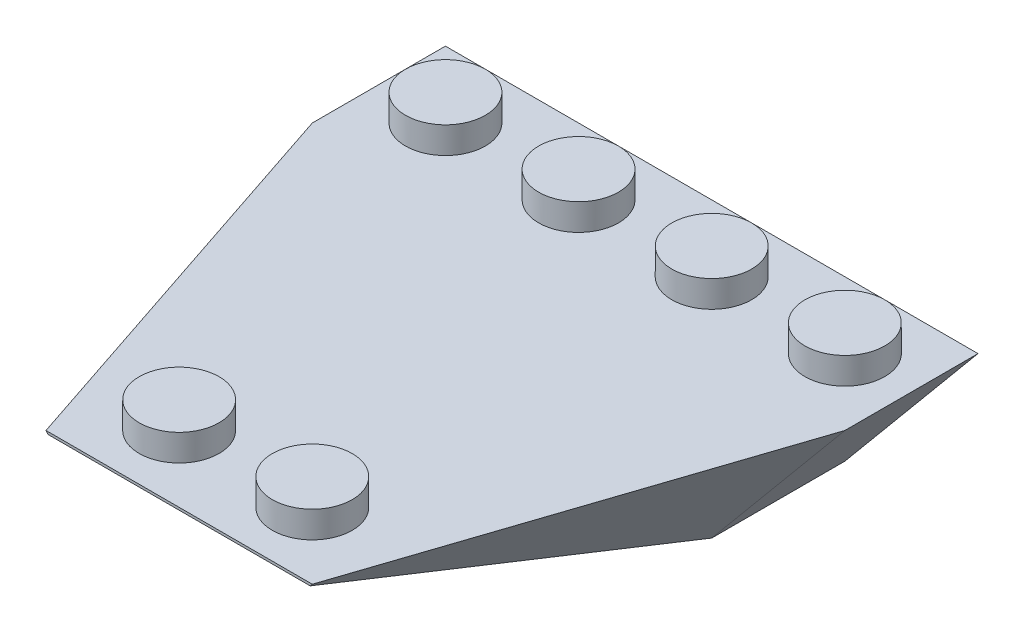
ISO-10303-21;
HEADER;
FILE_DESCRIPTION(('STEP AP214'),'2;1');
FILE_NAME('part.step','',(''),(''),'','','');
FILE_SCHEMA(('AUTOMOTIVE_DESIGN { 1 0 10303 214 1 1 1 1 }'));
ENDSEC;
DATA;
#1=APPLICATION_CONTEXT('core data for automotive mechanical design processes');
#2=APPLICATION_PROTOCOL_DEFINITION('international standard','automotive_design',2000,#1);
#3=PRODUCT_CONTEXT('',#1,'mechanical');
#4=PRODUCT('Part','Part','',(#3));
#5=PRODUCT_RELATED_PRODUCT_CATEGORY('part','',(#4));
#6=PRODUCT_DEFINITION_FORMATION('','',#4);
#7=PRODUCT_DEFINITION_CONTEXT('part definition',#1,'design');
#8=PRODUCT_DEFINITION('design','',#6,#7);
#9=PRODUCT_DEFINITION_SHAPE('','',#8);
#10=(LENGTH_UNIT() NAMED_UNIT(*) SI_UNIT(.MILLI.,.METRE.));
#11=(NAMED_UNIT(*) PLANE_ANGLE_UNIT() SI_UNIT($,.RADIAN.));
#12=(NAMED_UNIT(*) SI_UNIT($,.STERADIAN.) SOLID_ANGLE_UNIT());
#13=UNCERTAINTY_MEASURE_WITH_UNIT(LENGTH_MEASURE(1.E-05),#10,'distance_accuracy_value','');
#14=(GEOMETRIC_REPRESENTATION_CONTEXT(3) GLOBAL_UNCERTAINTY_ASSIGNED_CONTEXT((#13)) GLOBAL_UNIT_ASSIGNED_CONTEXT((#10,
#11,#12)) REPRESENTATION_CONTEXT('',''));
#15=CARTESIAN_POINT('',(0.,0.,0.));
#16=DIRECTION('',(0.,0.,1.));
#17=DIRECTION('',(1.,0.,0.));
#18=AXIS2_PLACEMENT_3D('',#15,#16,#17);
#19=CARTESIAN_POINT('',(0.,0.,0.));
#20=DIRECTION('',(0.,0.,-1.));
#21=DIRECTION('',(-1.,0.,0.));
#22=AXIS2_PLACEMENT_3D('',#19,#20,#21);
#23=PLANE('',#22);
#24=DIRECTION('',(1.,0.,0.));
#25=VECTOR('',#24,1.);
#26=CARTESIAN_POINT('',(-8.,0.,0.));
#27=LINE('',#26,#25);
#28=CARTESIAN_POINT('',(5.91726675309156,0.,0.));
#29=VERTEX_POINT('',#28);
#30=CARTESIAN_POINT('',(8.,0.,0.));
#31=VERTEX_POINT('',#30);
#32=EDGE_CURVE('E58',#29,#31,#27,.T.);
#33=ORIENTED_EDGE('',*,*,#32,.F.);
#34=DIRECTION('',(0.64018439966448,0.768221279597376,0.));
#35=VECTOR('',#34,1.);
#36=CARTESIAN_POINT('',(3.49215742805404,-2.91013119004503,0.));
#37=LINE('',#36,#35);
#38=CARTESIAN_POINT('',(12.5839334197582,8.,0.));
#39=VERTEX_POINT('',#38);
#40=EDGE_CURVE('E196',#29,#39,#37,.T.);
#41=ORIENTED_EDGE('',*,*,#40,.T.);
#42=DIRECTION('',(-1.,0.,0.));
#43=VECTOR('',#42,1.);
#44=CARTESIAN_POINT('',(0.,8.,0.));
#45=LINE('',#44,#43);
#46=CARTESIAN_POINT('',(-12.5839334197582,8.,0.));
#47=VERTEX_POINT('',#46);
#48=EDGE_CURVE('E211',#39,#47,#45,.T.);
#49=ORIENTED_EDGE('',*,*,#48,.T.);
#50=DIRECTION('',(0.64018439966448,-0.768221279597376,0.));
#51=VECTOR('',#50,1.);
#52=CARTESIAN_POINT('',(-3.49215742805403,-2.91013119004503,0.));
#53=LINE('',#52,#51);
#54=CARTESIAN_POINT('',(-5.91726675309156,0.,0.));
#55=VERTEX_POINT('',#54);
#56=EDGE_CURVE('E214',#47,#55,#53,.T.);
#57=ORIENTED_EDGE('',*,*,#56,.T.);
#58=CARTESIAN_POINT('',(-8.,0.,0.));
#59=VERTEX_POINT('',#58);
#60=EDGE_CURVE('E376',#59,#55,#27,.T.);
#61=ORIENTED_EDGE('',*,*,#60,.F.);
#62=DIRECTION('',(0.64018439966448,-0.768221279597376,0.));
#63=VECTOR('',#62,1.);
#64=CARTESIAN_POINT('',(-16.,9.6,0.));
#65=LINE('',#64,#63);
#66=CARTESIAN_POINT('',(-16.,9.6,0.));
#67=VERTEX_POINT('',#66);
#68=EDGE_CURVE('E460',#67,#59,#65,.T.);
#69=ORIENTED_EDGE('',*,*,#68,.F.);
#70=DIRECTION('',(-1.,0.,0.));
#71=VECTOR('',#70,1.);
#72=CARTESIAN_POINT('',(16.,9.6,0.));
#73=LINE('',#72,#71);
#74=CARTESIAN_POINT('',(16.,9.6,0.));
#75=VERTEX_POINT('',#74);
#76=EDGE_CURVE('E446',#75,#67,#73,.T.);
#77=ORIENTED_EDGE('',*,*,#76,.F.);
#78=DIRECTION('',(0.64018439966448,0.768221279597376,0.));
#79=VECTOR('',#78,1.);
#80=CARTESIAN_POINT('',(8.,0.,0.));
#81=LINE('',#80,#79);
#82=EDGE_CURVE('E319',#31,#75,#81,.T.);
#83=ORIENTED_EDGE('',*,*,#82,.F.);
#84=EDGE_LOOP('',(#33,#41,#49,#57,#61,#69,#77,#83));
#85=FACE_BOUND('',#84,.T.);
#86=ADVANCED_FACE('F54',(#85),#23,.T.);
#87=CARTESIAN_POINT('',(0.,0.,0.));
#88=DIRECTION('',(0.,1.,0.));
#89=DIRECTION('',(-1.,0.,0.));
#90=AXIS2_PLACEMENT_3D('',#87,#88,#89);
#91=PLANE('',#90);
#92=DIRECTION('',(0.,0.,1.));
#93=VECTOR('',#92,1.);
#94=CARTESIAN_POINT('',(5.91726675309156,0.,0.));
#95=LINE('',#94,#93);
#96=CARTESIAN_POINT('',(5.91726675309156,0.,3.63285359186768));
#97=VERTEX_POINT('',#96);
#98=EDGE_CURVE('E222',#29,#97,#95,.T.);
#99=ORIENTED_EDGE('',*,*,#98,.F.);
#100=ORIENTED_EDGE('',*,*,#32,.T.);
#101=DIRECTION('',(0.,0.,1.));
#102=VECTOR('',#101,1.);
#103=CARTESIAN_POINT('',(8.,0.,0.));
#104=LINE('',#103,#102);
#105=CARTESIAN_POINT('',(8.,0.,8.));
#106=VERTEX_POINT('',#105);
#107=EDGE_CURVE('E475',#31,#106,#104,.T.);
#108=ORIENTED_EDGE('',*,*,#107,.T.);
#109=DIRECTION('',(1.,0.,0.));
#110=VECTOR('',#109,1.);
#111=CARTESIAN_POINT('',(8.,0.,8.));
#112=LINE('',#111,#110);
#113=CARTESIAN_POINT('',(-8.,0.,8.));
#114=VERTEX_POINT('',#113);
#115=EDGE_CURVE('E473',#114,#106,#112,.T.);
#116=ORIENTED_EDGE('',*,*,#115,.F.);
#117=DIRECTION('',(0.,0.,1.));
#118=VECTOR('',#117,1.);
#119=CARTESIAN_POINT('',(-8.,0.,0.));
#120=LINE('',#119,#118);
#121=EDGE_CURVE('E80',#59,#114,#120,.T.);
#122=ORIENTED_EDGE('',*,*,#121,.F.);
#123=ORIENTED_EDGE('',*,*,#60,.T.);
#124=DIRECTION('',(0.,0.,1.));
#125=VECTOR('',#124,1.);
#126=CARTESIAN_POINT('',(-5.91726675309156,0.,0.));
#127=LINE('',#126,#125);
#128=CARTESIAN_POINT('',(-5.91726675309156,0.,3.63285359186767));
#129=VERTEX_POINT('',#128);
#130=EDGE_CURVE('E224',#55,#129,#127,.T.);
#131=ORIENTED_EDGE('',*,*,#130,.T.);
#132=DIRECTION('',(1.,0.,0.));
#133=VECTOR('',#132,1.);
#134=CARTESIAN_POINT('',(0.,0.,3.63285359186768));
#135=LINE('',#134,#133);
#136=EDGE_CURVE('E188',#129,#97,#135,.T.);
#137=ORIENTED_EDGE('',*,*,#136,.T.);
#138=EDGE_LOOP('',(#99,#100,#108,#116,#122,#123,#131,#137));
#139=FACE_BOUND('',#138,.T.);
#140=ADVANCED_FACE('F382',(#139),#91,.F.);
#141=CARTESIAN_POINT('',(-4.00000000000001,11.2,4.));
#142=DIRECTION('',(0.,1.,0.));
#143=DIRECTION('',(-1.,0.,0.));
#144=AXIS2_PLACEMENT_3D('',#141,#142,#143);
#145=PLANE('',#144);
#146=CARTESIAN_POINT('',(-4.00000000000001,11.2,4.));
#147=DIRECTION('',(0.,1.,0.));
#148=DIRECTION('',(-1.,0.,0.));
#149=AXIS2_PLACEMENT_3D('',#146,#147,#148);
#150=CIRCLE('',#149,2.4);
#151=CARTESIAN_POINT('',(-6.4,11.2,4.));
#152=VERTEX_POINT('',#151);
#153=EDGE_CURVE('E552',#152,#152,#150,.T.);
#154=ORIENTED_EDGE('',*,*,#153,.T.);
#155=EDGE_LOOP('',(#154));
#156=FACE_BOUND('',#155,.T.);
#157=ADVANCED_FACE('F56',(#156),#145,.T.);
#158=CARTESIAN_POINT('',(-4.00000000000001,11.2,4.));
#159=DIRECTION('',(0.,-1.,0.));
#160=DIRECTION('',(1.,0.,0.));
#161=AXIS2_PLACEMENT_3D('',#158,#159,#160);
#162=CYLINDRICAL_SURFACE('',#161,2.4);
#163=ORIENTED_EDGE('',*,*,#153,.F.);
#164=EDGE_LOOP('',(#163));
#165=FACE_BOUND('',#164,.T.);
#166=CARTESIAN_POINT('',(-4.00000000000001,9.6,4.));
#167=DIRECTION('',(0.,-1.,0.));
#168=DIRECTION('',(1.,0.,0.));
#169=AXIS2_PLACEMENT_3D('',#166,#167,#168);
#170=CIRCLE('',#169,2.4);
#171=CARTESIAN_POINT('',(-1.60000000000001,9.6,4.));
#172=VERTEX_POINT('',#171);
#173=EDGE_CURVE('E549',#172,#172,#170,.F.);
#174=ORIENTED_EDGE('',*,*,#173,.T.);
#175=EDGE_LOOP('',(#174));
#176=FACE_BOUND('',#175,.T.);
#177=ADVANCED_FACE('F621',(#165,#176),#162,.T.);
#178=CARTESIAN_POINT('',(-4.72131147540984,-3.9344262295082,0.));
#179=DIRECTION('',(0.768221279597376,0.64018439966448,0.));
#180=DIRECTION('',(-0.64018439966448,0.768221279597376,0.));
#181=AXIS2_PLACEMENT_3D('',#178,#179,#180);
#182=PLANE('',#181);
#183=ORIENTED_EDGE('',*,*,#121,.T.);
#184=DIRECTION('',(0.64018439966448,-0.768221279597376,0.));
#185=VECTOR('',#184,1.);
#186=CARTESIAN_POINT('',(-8.,0.,8.));
#187=LINE('',#186,#185);
#188=CARTESIAN_POINT('',(-16.,9.6,8.));
#189=VERTEX_POINT('',#188);
#190=EDGE_CURVE('E457',#189,#114,#187,.T.);
#191=ORIENTED_EDGE('',*,*,#190,.F.);
#192=DIRECTION('',(0.,0.,1.));
#193=VECTOR('',#192,1.);
#194=CARTESIAN_POINT('',(-16.,9.6,0.));
#195=LINE('',#194,#193);
#196=EDGE_CURVE('E439',#67,#189,#195,.T.);
#197=ORIENTED_EDGE('',*,*,#196,.F.);
#198=ORIENTED_EDGE('',*,*,#68,.T.);
#199=EDGE_LOOP('',(#183,#191,#197,#198));
#200=FACE_BOUND('',#199,.T.);
#201=ADVANCED_FACE('F391',(#200),#182,.F.);
#202=CARTESIAN_POINT('',(4.72131147540984,-3.93442622950819,0.));
#203=DIRECTION('',(-0.768221279597376,0.64018439966448,0.));
#204=DIRECTION('',(-0.64018439966448,-0.768221279597376,0.));
#205=AXIS2_PLACEMENT_3D('',#202,#203,#204);
#206=PLANE('',#205);
#207=DIRECTION('',(0.,0.,1.));
#208=VECTOR('',#207,1.);
#209=CARTESIAN_POINT('',(16.,9.6,0.));
#210=LINE('',#209,#208);
#211=CARTESIAN_POINT('',(16.,9.6,8.));
#212=VERTEX_POINT('',#211);
#213=EDGE_CURVE('E432',#75,#212,#210,.T.);
#214=ORIENTED_EDGE('',*,*,#213,.T.);
#215=DIRECTION('',(0.64018439966448,0.768221279597376,0.));
#216=VECTOR('',#215,1.);
#217=CARTESIAN_POINT('',(16.,9.6,8.));
#218=LINE('',#217,#216);
#219=EDGE_CURVE('E261',#106,#212,#218,.T.);
#220=ORIENTED_EDGE('',*,*,#219,.F.);
#221=ORIENTED_EDGE('',*,*,#107,.F.);
#222=ORIENTED_EDGE('',*,*,#82,.T.);
#223=EDGE_LOOP('',(#214,#220,#221,#222));
#224=FACE_BOUND('',#223,.T.);
#225=ADVANCED_FACE('F414',(#224),#206,.F.);
#226=CARTESIAN_POINT('',(0.,9.6,0.));
#227=DIRECTION('',(0.,-1.,0.));
#228=DIRECTION('',(1.,0.,0.));
#229=AXIS2_PLACEMENT_3D('',#226,#227,#228);
#230=PLANE('',#229);
#231=CARTESIAN_POINT('',(4.,9.6,28.));
#232=DIRECTION('',(0.,-1.,0.));
#233=DIRECTION('',(1.,0.,0.));
#234=AXIS2_PLACEMENT_3D('',#231,#232,#233);
#235=CIRCLE('',#234,2.4);
#236=CARTESIAN_POINT('',(6.4,9.6,28.));
#237=VERTEX_POINT('',#236);
#238=EDGE_CURVE('E12',#237,#237,#235,.F.);
#239=ORIENTED_EDGE('',*,*,#238,.F.);
#240=EDGE_LOOP('',(#239));
#241=FACE_BOUND('',#240,.T.);
#242=CARTESIAN_POINT('',(-4.,9.6,28.));
#243=DIRECTION('',(0.,-1.,0.));
#244=DIRECTION('',(1.,0.,0.));
#245=AXIS2_PLACEMENT_3D('',#242,#243,#244);
#246=CIRCLE('',#245,2.4);
#247=CARTESIAN_POINT('',(-1.6,9.6,28.));
#248=VERTEX_POINT('',#247);
#249=EDGE_CURVE('E64',#248,#248,#246,.F.);
#250=ORIENTED_EDGE('',*,*,#249,.F.);
#251=EDGE_LOOP('',(#250));
#252=FACE_BOUND('',#251,.T.);
#253=CARTESIAN_POINT('',(-12.,9.6,4.));
#254=DIRECTION('',(0.,-1.,0.));
#255=DIRECTION('',(1.,0.,0.));
#256=AXIS2_PLACEMENT_3D('',#253,#254,#255);
#257=CIRCLE('',#256,2.4);
#258=CARTESIAN_POINT('',(-9.60000000000001,9.6,4.));
#259=VERTEX_POINT('',#258);
#260=EDGE_CURVE('E555',#259,#259,#257,.F.);
#261=ORIENTED_EDGE('',*,*,#260,.F.);
#262=EDGE_LOOP('',(#261));
#263=FACE_BOUND('',#262,.T.);
#264=CARTESIAN_POINT('',(3.99999999999999,9.6,4.));
#265=DIRECTION('',(0.,-1.,0.));
#266=DIRECTION('',(1.,0.,0.));
#267=AXIS2_PLACEMENT_3D('',#264,#265,#266);
#268=CIRCLE('',#267,2.4);
#269=CARTESIAN_POINT('',(6.39999999999999,9.6,4.));
#270=VERTEX_POINT('',#269);
#271=EDGE_CURVE('E546',#270,#270,#268,.F.);
#272=ORIENTED_EDGE('',*,*,#271,.F.);
#273=EDGE_LOOP('',(#272));
#274=FACE_BOUND('',#273,.T.);
#275=CARTESIAN_POINT('',(12.,9.6,4.));
#276=DIRECTION('',(0.,-1.,0.));
#277=DIRECTION('',(1.,0.,0.));
#278=AXIS2_PLACEMENT_3D('',#275,#276,#277);
#279=CIRCLE('',#278,2.4);
#280=CARTESIAN_POINT('',(14.4,9.6,4.));
#281=VERTEX_POINT('',#280);
#282=EDGE_CURVE('E532',#281,#281,#279,.F.);
#283=ORIENTED_EDGE('',*,*,#282,.F.);
#284=EDGE_LOOP('',(#283));
#285=FACE_BOUND('',#284,.T.);
#286=ORIENTED_EDGE('',*,*,#196,.T.);
#287=DIRECTION('',(0.316227766016838,0.,0.948683298050514));
#288=VECTOR('',#287,1.);
#289=CARTESIAN_POINT('',(-16.,9.6,8.));
#290=LINE('',#289,#288);
#291=CARTESIAN_POINT('',(-8.,9.6,32.));
#292=VERTEX_POINT('',#291);
#293=EDGE_CURVE('E255',#189,#292,#290,.T.);
#294=ORIENTED_EDGE('',*,*,#293,.T.);
#295=DIRECTION('',(-1.,0.,0.));
#296=VECTOR('',#295,1.);
#297=CARTESIAN_POINT('',(-8.,9.6,32.));
#298=LINE('',#297,#296);
#299=CARTESIAN_POINT('',(8.,9.6,32.));
#300=VERTEX_POINT('',#299);
#301=EDGE_CURVE('E355',#300,#292,#298,.T.);
#302=ORIENTED_EDGE('',*,*,#301,.F.);
#303=DIRECTION('',(-0.316227766016838,0.,0.948683298050514));
#304=VECTOR('',#303,1.);
#305=CARTESIAN_POINT('',(16.,9.6,8.));
#306=LINE('',#305,#304);
#307=EDGE_CURVE('E560',#212,#300,#306,.T.);
#308=ORIENTED_EDGE('',*,*,#307,.F.);
#309=ORIENTED_EDGE('',*,*,#213,.F.);
#310=ORIENTED_EDGE('',*,*,#76,.T.);
#311=EDGE_LOOP('',(#286,#294,#302,#308,#309,#310));
#312=FACE_BOUND('',#311,.T.);
#313=ORIENTED_EDGE('',*,*,#173,.F.);
#314=EDGE_LOOP('',(#313));
#315=FACE_BOUND('',#314,.T.);
#316=ADVANCED_FACE('F338',(#241,#252,#263,#274,#285,#312,#315),#230,.F.);
#317=CARTESIAN_POINT('',(0.,0.,32.));
#318=DIRECTION('',(0.,0.,-1.));
#319=DIRECTION('',(-1.,0.,0.));
#320=AXIS2_PLACEMENT_3D('',#317,#318,#319);
#321=PLANE('',#320);
#322=DIRECTION('',(0.64018439966448,0.768221279597376,0.));
#323=VECTOR('',#322,1.);
#324=CARTESIAN_POINT('',(7.875,9.45,32.));
#325=LINE('',#324,#323);
#326=CARTESIAN_POINT('',(7.875,9.45,32.));
#327=VERTEX_POINT('',#326);
#328=EDGE_CURVE('E362',#327,#300,#325,.T.);
#329=ORIENTED_EDGE('',*,*,#328,.T.);
#330=ORIENTED_EDGE('',*,*,#301,.T.);
#331=DIRECTION('',(0.640184399664473,-0.768221279597382,0.));
#332=VECTOR('',#331,1.);
#333=CARTESIAN_POINT('',(-8.,9.6,32.));
#334=LINE('',#333,#332);
#335=CARTESIAN_POINT('',(-7.875,9.45,32.));
#336=VERTEX_POINT('',#335);
#337=EDGE_CURVE('E301',#292,#336,#334,.T.);
#338=ORIENTED_EDGE('',*,*,#337,.T.);
#339=DIRECTION('',(1.,0.,0.));
#340=VECTOR('',#339,1.);
#341=CARTESIAN_POINT('',(-7.875,9.45,32.));
#342=LINE('',#341,#340);
#343=EDGE_CURVE('E316',#336,#327,#342,.T.);
#344=ORIENTED_EDGE('',*,*,#343,.T.);
#345=EDGE_LOOP('',(#329,#330,#338,#344));
#346=FACE_BOUND('',#345,.T.);
#347=ADVANCED_FACE('F279',(#346),#321,.F.);
#348=CARTESIAN_POINT('',(5.9076923076923,-4.92307692307692,1.96923076923077));
#349=DIRECTION('',(-0.744208407535251,0.620173672946042,-0.248069469178417));
#350=DIRECTION('',(-0.64018439966448,-0.768221279597376,0.));
#351=AXIS2_PLACEMENT_3D('',#348,#349,#350);
#352=PLANE('',#351);
#353=ORIENTED_EDGE('',*,*,#307,.T.);
#354=ORIENTED_EDGE('',*,*,#328,.F.);
#355=DIRECTION('',(-0.00484613307320608,0.366367660334369,0.93045755005554));
#356=VECTOR('',#355,1.);
#357=CARTESIAN_POINT('',(8.,0.,8.));
#358=LINE('',#357,#356);
#359=EDGE_CURVE('E266',#106,#327,#358,.T.);
#360=ORIENTED_EDGE('',*,*,#359,.F.);
#361=ORIENTED_EDGE('',*,*,#219,.T.);
#362=EDGE_LOOP('',(#353,#354,#360,#361));
#363=FACE_BOUND('',#362,.T.);
#364=ADVANCED_FACE('F268',(#363),#352,.F.);
#365=CARTESIAN_POINT('',(-5.90769230769238,-4.92307692307689,1.96923076923076));
#366=DIRECTION('',(0.744208407535257,0.620173672946036,-0.248069469178414));
#367=DIRECTION('',(-0.640184399664473,0.768221279597382,0.));
#368=AXIS2_PLACEMENT_3D('',#365,#366,#367);
#369=PLANE('',#368);
#370=DIRECTION('',(0.00484613307320587,0.366367660334369,0.93045755005554));
#371=VECTOR('',#370,1.);
#372=CARTESIAN_POINT('',(-8.,0.,8.));
#373=LINE('',#372,#371);
#374=EDGE_CURVE('E561',#114,#336,#373,.T.);
#375=ORIENTED_EDGE('',*,*,#374,.T.);
#376=ORIENTED_EDGE('',*,*,#337,.F.);
#377=ORIENTED_EDGE('',*,*,#293,.F.);
#378=ORIENTED_EDGE('',*,*,#190,.T.);
#379=EDGE_LOOP('',(#375,#376,#377,#378));
#380=FACE_BOUND('',#379,.T.);
#381=ADVANCED_FACE('F278',(#380),#369,.F.);
#382=CARTESIAN_POINT('',(0.,-2.72718049308397,1.07382731915181));
#383=DIRECTION('',(0.,0.930468476148453,-0.366371962483453));
#384=DIRECTION('',(0.,0.366371962483453,0.930468476148453));
#385=AXIS2_PLACEMENT_3D('',#382,#383,#384);
#386=PLANE('',#385);
#387=ORIENTED_EDGE('',*,*,#359,.T.);
#388=ORIENTED_EDGE('',*,*,#343,.F.);
#389=ORIENTED_EDGE('',*,*,#374,.F.);
#390=ORIENTED_EDGE('',*,*,#115,.T.);
#391=EDGE_LOOP('',(#387,#388,#389,#390));
#392=FACE_BOUND('',#391,.T.);
#393=ADVANCED_FACE('F339',(#392),#386,.F.);
#394=CARTESIAN_POINT('',(12.,11.2,4.));
#395=DIRECTION('',(0.,-1.,0.));
#396=DIRECTION('',(1.,0.,0.));
#397=AXIS2_PLACEMENT_3D('',#394,#395,#396);
#398=CYLINDRICAL_SURFACE('',#397,2.4);
#399=CARTESIAN_POINT('',(12.,11.2,4.));
#400=DIRECTION('',(0.,1.,0.));
#401=DIRECTION('',(-1.,0.,0.));
#402=AXIS2_PLACEMENT_3D('',#399,#400,#401);
#403=CIRCLE('',#402,2.4);
#404=CARTESIAN_POINT('',(9.6,11.2,4.));
#405=VERTEX_POINT('',#404);
#406=EDGE_CURVE('E252',#405,#405,#403,.T.);
#407=ORIENTED_EDGE('',*,*,#406,.F.);
#408=EDGE_LOOP('',(#407));
#409=FACE_BOUND('',#408,.T.);
#410=ORIENTED_EDGE('',*,*,#282,.T.);
#411=EDGE_LOOP('',(#410));
#412=FACE_BOUND('',#411,.T.);
#413=ADVANCED_FACE('F280',(#409,#412),#398,.T.);
#414=CARTESIAN_POINT('',(12.,11.2,4.));
#415=DIRECTION('',(0.,1.,0.));
#416=DIRECTION('',(-1.,0.,0.));
#417=AXIS2_PLACEMENT_3D('',#414,#415,#416);
#418=PLANE('',#417);
#419=ORIENTED_EDGE('',*,*,#406,.T.);
#420=EDGE_LOOP('',(#419));
#421=FACE_BOUND('',#420,.T.);
#422=ADVANCED_FACE('F673',(#421),#418,.T.);
#423=CARTESIAN_POINT('',(3.99999999999999,11.2,4.));
#424=DIRECTION('',(0.,-1.,0.));
#425=DIRECTION('',(1.,0.,0.));
#426=AXIS2_PLACEMENT_3D('',#423,#424,#425);
#427=CYLINDRICAL_SURFACE('',#426,2.4);
#428=CARTESIAN_POINT('',(3.99999999999999,11.2,4.));
#429=DIRECTION('',(0.,1.,0.));
#430=DIRECTION('',(-1.,0.,0.));
#431=AXIS2_PLACEMENT_3D('',#428,#429,#430);
#432=CIRCLE('',#431,2.4);
#433=CARTESIAN_POINT('',(1.6,11.2,4.));
#434=VERTEX_POINT('',#433);
#435=EDGE_CURVE('E249',#434,#434,#432,.T.);
#436=ORIENTED_EDGE('',*,*,#435,.F.);
#437=EDGE_LOOP('',(#436));
#438=FACE_BOUND('',#437,.T.);
#439=ORIENTED_EDGE('',*,*,#271,.T.);
#440=EDGE_LOOP('',(#439));
#441=FACE_BOUND('',#440,.T.);
#442=ADVANCED_FACE('F681',(#438,#441),#427,.T.);
#443=CARTESIAN_POINT('',(3.99999999999999,11.2,4.));
#444=DIRECTION('',(0.,1.,0.));
#445=DIRECTION('',(-1.,0.,0.));
#446=AXIS2_PLACEMENT_3D('',#443,#444,#445);
#447=PLANE('',#446);
#448=ORIENTED_EDGE('',*,*,#435,.T.);
#449=EDGE_LOOP('',(#448));
#450=FACE_BOUND('',#449,.T.);
#451=ADVANCED_FACE('F689',(#450),#447,.T.);
#452=CARTESIAN_POINT('',(-12.,11.2,4.));
#453=DIRECTION('',(0.,-1.,0.));
#454=DIRECTION('',(1.,0.,0.));
#455=AXIS2_PLACEMENT_3D('',#452,#453,#454);
#456=CYLINDRICAL_SURFACE('',#455,2.4);
#457=CARTESIAN_POINT('',(-12.,11.2,4.));
#458=DIRECTION('',(0.,1.,0.));
#459=DIRECTION('',(-1.,0.,0.));
#460=AXIS2_PLACEMENT_3D('',#457,#458,#459);
#461=CIRCLE('',#460,2.4);
#462=CARTESIAN_POINT('',(-14.4,11.2,4.));
#463=VERTEX_POINT('',#462);
#464=EDGE_CURVE('E246',#463,#463,#461,.T.);
#465=ORIENTED_EDGE('',*,*,#464,.F.);
#466=EDGE_LOOP('',(#465));
#467=FACE_BOUND('',#466,.T.);
#468=ORIENTED_EDGE('',*,*,#260,.T.);
#469=EDGE_LOOP('',(#468));
#470=FACE_BOUND('',#469,.T.);
#471=ADVANCED_FACE('F697',(#467,#470),#456,.T.);
#472=CARTESIAN_POINT('',(-12.,11.2,4.));
#473=DIRECTION('',(0.,1.,0.));
#474=DIRECTION('',(-1.,0.,0.));
#475=AXIS2_PLACEMENT_3D('',#472,#473,#474);
#476=PLANE('',#475);
#477=ORIENTED_EDGE('',*,*,#464,.T.);
#478=EDGE_LOOP('',(#477));
#479=FACE_BOUND('',#478,.T.);
#480=ADVANCED_FACE('F705',(#479),#476,.T.);
#481=CARTESIAN_POINT('',(-4.,11.2,28.));
#482=DIRECTION('',(0.,-1.,0.));
#483=DIRECTION('',(1.,0.,0.));
#484=AXIS2_PLACEMENT_3D('',#481,#482,#483);
#485=CYLINDRICAL_SURFACE('',#484,2.4);
#486=CARTESIAN_POINT('',(-4.,11.2,28.));
#487=DIRECTION('',(0.,1.,0.));
#488=DIRECTION('',(-1.,0.,0.));
#489=AXIS2_PLACEMENT_3D('',#486,#487,#488);
#490=CIRCLE('',#489,2.4);
#491=CARTESIAN_POINT('',(-6.4,11.2,28.));
#492=VERTEX_POINT('',#491);
#493=EDGE_CURVE('E243',#492,#492,#490,.T.);
#494=ORIENTED_EDGE('',*,*,#493,.F.);
#495=EDGE_LOOP('',(#494));
#496=FACE_BOUND('',#495,.T.);
#497=ORIENTED_EDGE('',*,*,#249,.T.);
#498=EDGE_LOOP('',(#497));
#499=FACE_BOUND('',#498,.T.);
#500=ADVANCED_FACE('F713',(#496,#499),#485,.T.);
#501=CARTESIAN_POINT('',(-4.,11.2,28.));
#502=DIRECTION('',(0.,1.,0.));
#503=DIRECTION('',(-1.,0.,0.));
#504=AXIS2_PLACEMENT_3D('',#501,#502,#503);
#505=PLANE('',#504);
#506=ORIENTED_EDGE('',*,*,#493,.T.);
#507=EDGE_LOOP('',(#506));
#508=FACE_BOUND('',#507,.T.);
#509=ADVANCED_FACE('F721',(#508),#505,.T.);
#510=CARTESIAN_POINT('',(4.,11.2,28.));
#511=DIRECTION('',(0.,-1.,0.));
#512=DIRECTION('',(1.,0.,0.));
#513=AXIS2_PLACEMENT_3D('',#510,#511,#512);
#514=CYLINDRICAL_SURFACE('',#513,2.4);
#515=CARTESIAN_POINT('',(4.,11.2,28.));
#516=DIRECTION('',(0.,1.,0.));
#517=DIRECTION('',(-1.,0.,0.));
#518=AXIS2_PLACEMENT_3D('',#515,#516,#517);
#519=CIRCLE('',#518,2.4);
#520=CARTESIAN_POINT('',(1.6,11.2,28.));
#521=VERTEX_POINT('',#520);
#522=EDGE_CURVE('E240',#521,#521,#519,.T.);
#523=ORIENTED_EDGE('',*,*,#522,.F.);
#524=EDGE_LOOP('',(#523));
#525=FACE_BOUND('',#524,.T.);
#526=ORIENTED_EDGE('',*,*,#238,.T.);
#527=EDGE_LOOP('',(#526));
#528=FACE_BOUND('',#527,.T.);
#529=ADVANCED_FACE('F728',(#525,#528),#514,.T.);
#530=CARTESIAN_POINT('',(4.,11.2,28.));
#531=DIRECTION('',(0.,1.,0.));
#532=DIRECTION('',(-1.,0.,0.));
#533=AXIS2_PLACEMENT_3D('',#530,#531,#532);
#534=PLANE('',#533);
#535=ORIENTED_EDGE('',*,*,#522,.T.);
#536=EDGE_LOOP('',(#535));
#537=FACE_BOUND('',#536,.T.);
#538=ADVANCED_FACE('F735',(#537),#534,.T.);
#539=CARTESIAN_POINT('',(-4.00000000000001,9.6,4.));
#540=DIRECTION('',(0.,1.,0.));
#541=DIRECTION('',(-1.,0.,0.));
#542=AXIS2_PLACEMENT_3D('',#539,#540,#541);
#543=PLANE('',#542);
#544=CARTESIAN_POINT('',(-4.00000000000001,9.6,4.));
#545=DIRECTION('',(0.,1.,0.));
#546=DIRECTION('',(-1.,0.,0.));
#547=AXIS2_PLACEMENT_3D('',#544,#545,#546);
#548=CIRCLE('',#547,0.799999999999999);
#549=CARTESIAN_POINT('',(-4.8,9.6,4.));
#550=VERTEX_POINT('',#549);
#551=EDGE_CURVE('E908',#550,#550,#548,.T.);
#552=ORIENTED_EDGE('',*,*,#551,.F.);
#553=EDGE_LOOP('',(#552));
#554=FACE_BOUND('',#553,.T.);
#555=ADVANCED_FACE('F742',(#554),#543,.F.);
#556=CARTESIAN_POINT('',(-4.00000000000001,11.2,4.));
#557=DIRECTION('',(0.,-1.,0.));
#558=DIRECTION('',(1.,0.,0.));
#559=AXIS2_PLACEMENT_3D('',#556,#557,#558);
#560=CYLINDRICAL_SURFACE('',#559,0.799999999999999);
#561=ORIENTED_EDGE('',*,*,#551,.T.);
#562=EDGE_LOOP('',(#561));
#563=FACE_BOUND('',#562,.T.);
#564=CARTESIAN_POINT('',(-4.,8.,4.));
#565=DIRECTION('',(0.,-1.,0.));
#566=DIRECTION('',(1.,0.,0.));
#567=AXIS2_PLACEMENT_3D('',#564,#565,#566);
#568=CIRCLE('',#567,0.799999999999999);
#569=CARTESIAN_POINT('',(-3.20000000000001,8.,4.));
#570=VERTEX_POINT('',#569);
#571=EDGE_CURVE('E911',#570,#570,#568,.F.);
#572=ORIENTED_EDGE('',*,*,#571,.F.);
#573=EDGE_LOOP('',(#572));
#574=FACE_BOUND('',#573,.T.);
#575=ADVANCED_FACE('F749',(#563,#574),#560,.F.);
#576=CARTESIAN_POINT('',(-3.49215742805404,-2.91013119004503,0.));
#577=DIRECTION('',(0.768221279597376,0.64018439966448,0.));
#578=DIRECTION('',(-0.64018439966448,0.768221279597376,0.));
#579=AXIS2_PLACEMENT_3D('',#576,#577,#578);
#580=PLANE('',#579);
#581=ORIENTED_EDGE('',*,*,#130,.F.);
#582=ORIENTED_EDGE('',*,*,#56,.F.);
#583=DIRECTION('',(0.,0.,1.));
#584=VECTOR('',#583,1.);
#585=CARTESIAN_POINT('',(-12.5839334197582,8.,0.));
#586=LINE('',#585,#584);
#587=CARTESIAN_POINT('',(-12.5839334197582,8.,3.45317117734207));
#588=VERTEX_POINT('',#587);
#589=EDGE_CURVE('E180',#47,#588,#586,.T.);
#590=ORIENTED_EDGE('',*,*,#589,.T.);
#591=CARTESIAN_POINT('',(-12.,7.29927989629013,4.));
#592=DIRECTION('',(0.768221279597376,0.64018439966448,0.));
#593=DIRECTION('',(0.64018439966448,-0.768221279597376,0.));
#594=AXIS2_PLACEMENT_3D('',#591,#592,#593);
#595=ELLIPSE('',#594,1.24963994814506,0.799999999999999);
#596=CARTESIAN_POINT('',(-12.5839334197582,8.,4.54682882265794));
#597=VERTEX_POINT('',#596);
#598=EDGE_CURVE('E179',#597,#588,#595,.F.);
#599=ORIENTED_EDGE('',*,*,#598,.F.);
#600=CARTESIAN_POINT('',(-12.5839334197582,8.,7.79839354208613));
#601=VERTEX_POINT('',#600);
#602=EDGE_CURVE('E165',#597,#601,#586,.T.);
#603=ORIENTED_EDGE('',*,*,#602,.T.);
#604=DIRECTION('',(0.64018439966448,-0.768221279597376,0.));
#605=VECTOR('',#604,1.);
#606=CARTESIAN_POINT('',(-3.49215742805422,-2.91013119004481,7.79839354208666));
#607=LINE('',#606,#605);
#608=CARTESIAN_POINT('',(-7.28408454925709,1.64018135539864,7.79839354208644));
#609=VERTEX_POINT('',#608);
#610=EDGE_CURVE('E177',#601,#609,#607,.T.);
#611=ORIENTED_EDGE('',*,*,#610,.T.);
#612=DIRECTION('',(0.292003701862322,-0.350404442234787,-0.889916043770887));
#613=VECTOR('',#612,1.);
#614=CARTESIAN_POINT('',(-4.4686952289766,-1.73828582893795,-0.78184057686363));
#615=LINE('',#614,#613);
#616=EDGE_CURVE('E72',#609,#129,#615,.T.);
#617=ORIENTED_EDGE('',*,*,#616,.T.);
#618=EDGE_LOOP('',(#581,#582,#590,#599,#603,#611,#617));
#619=FACE_BOUND('',#618,.T.);
#620=ADVANCED_FACE('F176',(#619),#580,.T.);
#621=CARTESIAN_POINT('',(3.49215742805404,-2.91013119004503,0.));
#622=DIRECTION('',(-0.768221279597376,0.64018439966448,0.));
#623=DIRECTION('',(-0.64018439966448,-0.768221279597376,0.));
#624=AXIS2_PLACEMENT_3D('',#621,#622,#623);
#625=PLANE('',#624);
#626=DIRECTION('',(0.,0.,1.));
#627=VECTOR('',#626,1.);
#628=CARTESIAN_POINT('',(12.5839334197582,8.,0.));
#629=LINE('',#628,#627);
#630=CARTESIAN_POINT('',(12.5839334197582,8.,4.54682882265793));
#631=VERTEX_POINT('',#630);
#632=CARTESIAN_POINT('',(12.5839334197582,8.,7.79839354208647));
#633=VERTEX_POINT('',#632);
#634=EDGE_CURVE('E181',#631,#633,#629,.T.);
#635=ORIENTED_EDGE('',*,*,#634,.F.);
#636=CARTESIAN_POINT('',(12.,7.29927989629013,4.));
#637=DIRECTION('',(-0.768221279597376,0.64018439966448,0.));
#638=DIRECTION('',(-0.64018439966448,-0.768221279597376,0.));
#639=AXIS2_PLACEMENT_3D('',#636,#637,#638);
#640=ELLIPSE('',#639,1.24963994814506,0.799999999999999);
#641=CARTESIAN_POINT('',(12.5839334197582,8.,3.45317117734207));
#642=VERTEX_POINT('',#641);
#643=EDGE_CURVE('E237',#631,#642,#640,.T.);
#644=ORIENTED_EDGE('',*,*,#643,.T.);
#645=EDGE_CURVE('E229',#39,#642,#629,.T.);
#646=ORIENTED_EDGE('',*,*,#645,.F.);
#647=ORIENTED_EDGE('',*,*,#40,.F.);
#648=ORIENTED_EDGE('',*,*,#98,.T.);
#649=DIRECTION('',(-0.292003701862322,-0.350404442234787,-0.889916043770887));
#650=VECTOR('',#649,1.);
#651=CARTESIAN_POINT('',(4.4686952289766,-1.73828582893795,-0.781840576863628));
#652=LINE('',#651,#650);
#653=CARTESIAN_POINT('',(7.2840845492571,1.64018135539865,7.79839354208647));
#654=VERTEX_POINT('',#653);
#655=EDGE_CURVE('E206',#654,#97,#652,.T.);
#656=ORIENTED_EDGE('',*,*,#655,.F.);
#657=DIRECTION('',(0.64018439966448,0.768221279597376,0.));
#658=VECTOR('',#657,1.);
#659=CARTESIAN_POINT('',(3.49215742805403,-2.91013119004503,7.79839354208646));
#660=LINE('',#659,#658);
#661=EDGE_CURVE('E185',#654,#633,#660,.T.);
#662=ORIENTED_EDGE('',*,*,#661,.T.);
#663=EDGE_LOOP('',(#635,#644,#646,#647,#648,#656,#662));
#664=FACE_BOUND('',#663,.T.);
#665=ADVANCED_FACE('F764',(#664),#625,.T.);
#666=CARTESIAN_POINT('',(0.,8.,0.));
#667=DIRECTION('',(0.,-1.,0.));
#668=DIRECTION('',(1.,0.,0.));
#669=AXIS2_PLACEMENT_3D('',#666,#667,#668);
#670=PLANE('',#669);
#671=DIRECTION('',(-1.,0.,0.));
#672=VECTOR('',#671,1.);
#673=CARTESIAN_POINT('',(0.,8.,23.950313909328));
#674=LINE('',#673,#672);
#675=CARTESIAN_POINT('',(7.19995996401105,8.,23.950313909328));
#676=VERTEX_POINT('',#675);
#677=CARTESIAN_POINT('',(-7.19995996401104,8.,23.950313909328));
#678=VERTEX_POINT('',#677);
#679=EDGE_CURVE('E168',#676,#678,#674,.T.);
#680=ORIENTED_EDGE('',*,*,#679,.T.);
#681=DIRECTION('',(0.316227766016833,0.,0.948683298050516));
#682=VECTOR('',#681,1.);
#683=CARTESIAN_POINT('',(-13.6650581404083,8.,4.555019380136));
#684=LINE('',#683,#682);
#685=EDGE_CURVE('E160',#601,#678,#684,.T.);
#686=ORIENTED_EDGE('',*,*,#685,.F.);
#687=ORIENTED_EDGE('',*,*,#602,.F.);
#688=CARTESIAN_POINT('',(-12.,8.,4.));
#689=DIRECTION('',(0.,-1.,0.));
#690=DIRECTION('',(1.,0.,0.));
#691=AXIS2_PLACEMENT_3D('',#688,#689,#690);
#692=CIRCLE('',#691,0.799999999999999);
#693=EDGE_CURVE('E209',#597,#588,#692,.F.);
#694=ORIENTED_EDGE('',*,*,#693,.T.);
#695=ORIENTED_EDGE('',*,*,#589,.F.);
#696=ORIENTED_EDGE('',*,*,#48,.F.);
#697=ORIENTED_EDGE('',*,*,#645,.T.);
#698=CARTESIAN_POINT('',(12.,8.,4.));
#699=DIRECTION('',(0.,-1.,0.));
#700=DIRECTION('',(1.,0.,0.));
#701=AXIS2_PLACEMENT_3D('',#698,#699,#700);
#702=CIRCLE('',#701,0.799999999999999);
#703=EDGE_CURVE('E217',#642,#631,#702,.F.);
#704=ORIENTED_EDGE('',*,*,#703,.T.);
#705=ORIENTED_EDGE('',*,*,#634,.T.);
#706=DIRECTION('',(-0.316227766016838,0.,0.948683298050514));
#707=VECTOR('',#706,1.);
#708=CARTESIAN_POINT('',(13.6650581404083,8.,4.55501938013611));
#709=LINE('',#708,#707);
#710=EDGE_CURVE('E173',#633,#676,#709,.T.);
#711=ORIENTED_EDGE('',*,*,#710,.T.);
#712=EDGE_LOOP('',(#680,#686,#687,#694,#695,#696,#697,#704,#705,#711));
#713=FACE_BOUND('',#712,.T.);
#714=CARTESIAN_POINT('',(4.,8.,4.));
#715=DIRECTION('',(0.,-1.,0.));
#716=DIRECTION('',(1.,0.,0.));
#717=AXIS2_PLACEMENT_3D('',#714,#715,#716);
#718=CIRCLE('',#717,0.799999999999999);
#719=CARTESIAN_POINT('',(4.79999999999999,8.,4.));
#720=VERTEX_POINT('',#719);
#721=EDGE_CURVE('E915',#720,#720,#718,.F.);
#722=ORIENTED_EDGE('',*,*,#721,.T.);
#723=EDGE_LOOP('',(#722));
#724=FACE_BOUND('',#723,.T.);
#725=ORIENTED_EDGE('',*,*,#571,.T.);
#726=EDGE_LOOP('',(#725));
#727=FACE_BOUND('',#726,.T.);
#728=ADVANCED_FACE('F162',(#713,#724,#727),#670,.T.);
#729=CARTESIAN_POINT('',(4.7169588556359,-3.93079904636325,1.5723196185453));
#730=DIRECTION('',(-0.744208407535251,0.620173672946042,-0.248069469178417));
#731=DIRECTION('',(-0.64018439966448,-0.768221279597376,0.));
#732=AXIS2_PLACEMENT_3D('',#729,#730,#731);
#733=PLANE('',#732);
#734=ORIENTED_EDGE('',*,*,#710,.F.);
#735=ORIENTED_EDGE('',*,*,#661,.F.);
#736=DIRECTION('',(-0.00484613307320586,0.366367660334369,0.93045755005554));
#737=VECTOR('',#736,1.);
#738=CARTESIAN_POINT('',(7.32198947035216,-1.2254306793883,0.520648691833894));
#739=LINE('',#738,#737);
#740=EDGE_CURVE('E194',#654,#676,#739,.T.);
#741=ORIENTED_EDGE('',*,*,#740,.T.);
#742=EDGE_LOOP('',(#734,#735,#741));
#743=FACE_BOUND('',#742,.T.);
#744=ADVANCED_FACE('F778',(#743),#733,.T.);
#745=CARTESIAN_POINT('',(-4.71695885563597,-3.93079904636323,1.57231961854529));
#746=DIRECTION('',(0.744208407535257,0.620173672946036,-0.248069469178414));
#747=DIRECTION('',(-0.640184399664473,0.768221279597382,0.));
#748=AXIS2_PLACEMENT_3D('',#745,#746,#747);
#749=PLANE('',#748);
#750=DIRECTION('',(0.00484613307320596,0.366367660334369,0.93045755005554));
#751=VECTOR('',#750,1.);
#752=CARTESIAN_POINT('',(-7.32198947035216,-1.2254306793883,0.520648691833894));
#753=LINE('',#752,#751);
#754=EDGE_CURVE('E184',#609,#678,#753,.T.);
#755=ORIENTED_EDGE('',*,*,#754,.F.);
#756=ORIENTED_EDGE('',*,*,#610,.F.);
#757=ORIENTED_EDGE('',*,*,#685,.T.);
#758=EDGE_LOOP('',(#755,#756,#757));
#759=FACE_BOUND('',#758,.T.);
#760=ADVANCED_FACE('F183',(#759),#749,.T.);
#761=CARTESIAN_POINT('',(0.,-1.23843093124645,0.487632179178288));
#762=DIRECTION('',(0.,0.930468476148453,-0.366371962483453));
#763=DIRECTION('',(0.,0.366371962483453,0.930468476148453));
#764=AXIS2_PLACEMENT_3D('',#761,#762,#763);
#765=PLANE('',#764);
#766=ORIENTED_EDGE('',*,*,#740,.F.);
#767=ORIENTED_EDGE('',*,*,#655,.T.);
#768=ORIENTED_EDGE('',*,*,#136,.F.);
#769=ORIENTED_EDGE('',*,*,#616,.F.);
#770=ORIENTED_EDGE('',*,*,#754,.T.);
#771=ORIENTED_EDGE('',*,*,#679,.F.);
#772=EDGE_LOOP('',(#766,#767,#768,#769,#770,#771));
#773=FACE_BOUND('',#772,.T.);
#774=ADVANCED_FACE('F792',(#773),#765,.T.);
#775=CARTESIAN_POINT('',(12.,11.2,4.));
#776=DIRECTION('',(0.,-1.,0.));
#777=DIRECTION('',(1.,0.,0.));
#778=AXIS2_PLACEMENT_3D('',#775,#776,#777);
#779=CYLINDRICAL_SURFACE('',#778,0.799999999999999);
#780=CARTESIAN_POINT('',(12.,9.6,4.));
#781=DIRECTION('',(0.,1.,0.));
#782=DIRECTION('',(-1.,0.,0.));
#783=AXIS2_PLACEMENT_3D('',#780,#781,#782);
#784=CIRCLE('',#783,0.799999999999999);
#785=CARTESIAN_POINT('',(11.2,9.6,4.));
#786=VERTEX_POINT('',#785);
#787=EDGE_CURVE('E174',#786,#786,#784,.T.);
#788=ORIENTED_EDGE('',*,*,#787,.T.);
#789=EDGE_LOOP('',(#788));
#790=FACE_BOUND('',#789,.T.);
#791=ORIENTED_EDGE('',*,*,#703,.F.);
#792=ORIENTED_EDGE('',*,*,#643,.F.);
#793=EDGE_LOOP('',(#791,#792));
#794=FACE_BOUND('',#793,.T.);
#795=ADVANCED_FACE('F799',(#790,#794),#779,.F.);
#796=CARTESIAN_POINT('',(12.,9.6,4.));
#797=DIRECTION('',(0.,1.,0.));
#798=DIRECTION('',(-1.,0.,0.));
#799=AXIS2_PLACEMENT_3D('',#796,#797,#798);
#800=PLANE('',#799);
#801=ORIENTED_EDGE('',*,*,#787,.F.);
#802=EDGE_LOOP('',(#801));
#803=FACE_BOUND('',#802,.T.);
#804=ADVANCED_FACE('F807',(#803),#800,.F.);
#805=CARTESIAN_POINT('',(3.99999999999999,11.2,4.));
#806=DIRECTION('',(0.,-1.,0.));
#807=DIRECTION('',(1.,0.,0.));
#808=AXIS2_PLACEMENT_3D('',#805,#806,#807);
#809=CYLINDRICAL_SURFACE('',#808,0.799999999999999);
#810=CARTESIAN_POINT('',(3.99999999999999,9.6,4.));
#811=DIRECTION('',(0.,1.,0.));
#812=DIRECTION('',(-1.,0.,0.));
#813=AXIS2_PLACEMENT_3D('',#810,#811,#812);
#814=CIRCLE('',#813,0.799999999999999);
#815=CARTESIAN_POINT('',(3.2,9.6,4.));
#816=VERTEX_POINT('',#815);
#817=EDGE_CURVE('E200',#816,#816,#814,.T.);
#818=ORIENTED_EDGE('',*,*,#817,.T.);
#819=EDGE_LOOP('',(#818));
#820=FACE_BOUND('',#819,.T.);
#821=ORIENTED_EDGE('',*,*,#721,.F.);
#822=EDGE_LOOP('',(#821));
#823=FACE_BOUND('',#822,.T.);
#824=ADVANCED_FACE('F815',(#820,#823),#809,.F.);
#825=CARTESIAN_POINT('',(3.99999999999999,9.6,4.));
#826=DIRECTION('',(0.,1.,0.));
#827=DIRECTION('',(-1.,0.,0.));
#828=AXIS2_PLACEMENT_3D('',#825,#826,#827);
#829=PLANE('',#828);
#830=ORIENTED_EDGE('',*,*,#817,.F.);
#831=EDGE_LOOP('',(#830));
#832=FACE_BOUND('',#831,.T.);
#833=ADVANCED_FACE('F823',(#832),#829,.F.);
#834=CARTESIAN_POINT('',(-12.,11.2,4.));
#835=DIRECTION('',(0.,-1.,0.));
#836=DIRECTION('',(1.,0.,0.));
#837=AXIS2_PLACEMENT_3D('',#834,#835,#836);
#838=CYLINDRICAL_SURFACE('',#837,0.799999999999999);
#839=CARTESIAN_POINT('',(-12.,9.6,4.));
#840=DIRECTION('',(0.,1.,0.));
#841=DIRECTION('',(-1.,0.,0.));
#842=AXIS2_PLACEMENT_3D('',#839,#840,#841);
#843=CIRCLE('',#842,0.799999999999999);
#844=CARTESIAN_POINT('',(-12.8,9.6,4.));
#845=VERTEX_POINT('',#844);
#846=EDGE_CURVE('E203',#845,#845,#843,.T.);
#847=ORIENTED_EDGE('',*,*,#846,.T.);
#848=EDGE_LOOP('',(#847));
#849=FACE_BOUND('',#848,.T.);
#850=ORIENTED_EDGE('',*,*,#693,.F.);
#851=ORIENTED_EDGE('',*,*,#598,.T.);
#852=EDGE_LOOP('',(#850,#851));
#853=FACE_BOUND('',#852,.T.);
#854=ADVANCED_FACE('F831',(#849,#853),#838,.F.);
#855=CARTESIAN_POINT('',(-12.,9.6,4.));
#856=DIRECTION('',(0.,1.,0.));
#857=DIRECTION('',(-1.,0.,0.));
#858=AXIS2_PLACEMENT_3D('',#855,#856,#857);
#859=PLANE('',#858);
#860=ORIENTED_EDGE('',*,*,#846,.F.);
#861=EDGE_LOOP('',(#860));
#862=FACE_BOUND('',#861,.T.);
#863=ADVANCED_FACE('F839',(#862),#859,.F.);
#864=CLOSED_SHELL('',(#86,#140,#157,#177,#201,#225,#316,#347,#364,#381,#393,#413,#422,#442,#451,
#471,#480,#500,#509,#529,#538,#555,#575,#620,#665,#728,#744,#760,#774,#795,#804,#824,#833,#854,#863));
#865=MANIFOLD_SOLID_BREP('B2',#864);
#866=ADVANCED_BREP_SHAPE_REPRESENTATION('',(#18,#865),#14);
#867=SHAPE_DEFINITION_REPRESENTATION(#9,#866);
ENDSEC;
END-ISO-10303-21;
